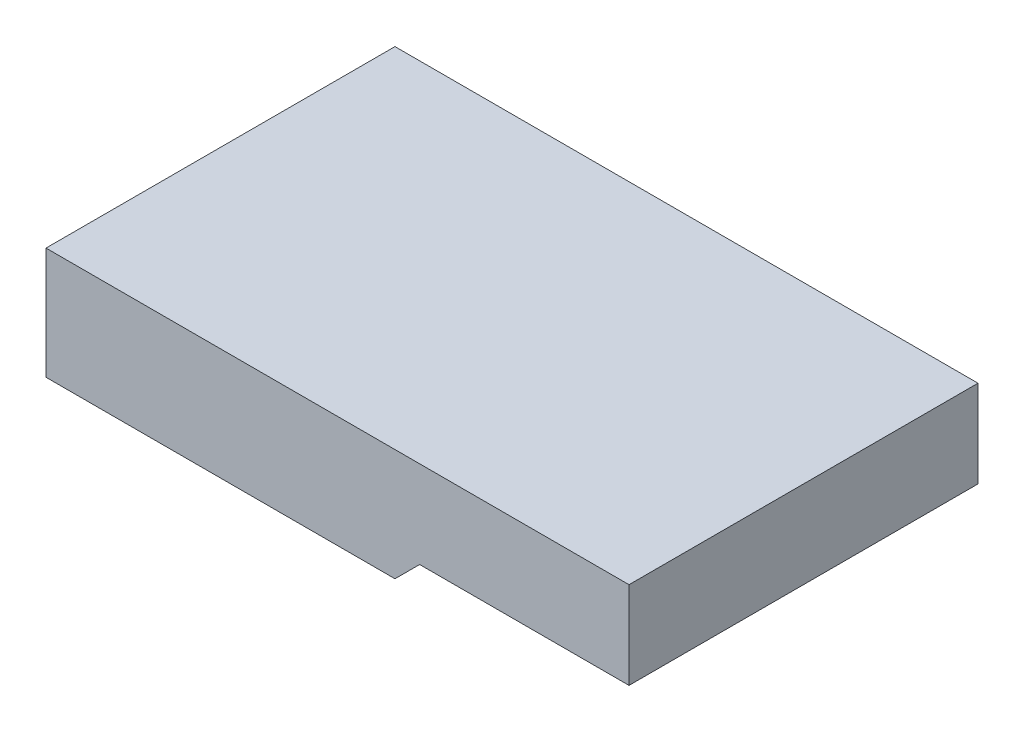
ISO-10303-21;
HEADER;
FILE_DESCRIPTION(('STEP AP214'),'2;1');
FILE_NAME('part.step','',(''),(''),'','','');
FILE_SCHEMA(('AUTOMOTIVE_DESIGN { 1 0 10303 214 1 1 1 1 }'));
ENDSEC;
DATA;
#1=APPLICATION_CONTEXT('core data for automotive mechanical design processes');
#2=APPLICATION_PROTOCOL_DEFINITION('international standard','automotive_design',2000,#1);
#3=PRODUCT_CONTEXT('',#1,'mechanical');
#4=PRODUCT('Part','Part','',(#3));
#5=PRODUCT_RELATED_PRODUCT_CATEGORY('part','',(#4));
#6=PRODUCT_DEFINITION_FORMATION('','',#4);
#7=PRODUCT_DEFINITION_CONTEXT('part definition',#1,'design');
#8=PRODUCT_DEFINITION('design','',#6,#7);
#9=PRODUCT_DEFINITION_SHAPE('','',#8);
#10=(LENGTH_UNIT() NAMED_UNIT(*) SI_UNIT(.MILLI.,.METRE.));
#11=(NAMED_UNIT(*) PLANE_ANGLE_UNIT() SI_UNIT($,.RADIAN.));
#12=(NAMED_UNIT(*) SI_UNIT($,.STERADIAN.) SOLID_ANGLE_UNIT());
#13=UNCERTAINTY_MEASURE_WITH_UNIT(LENGTH_MEASURE(1.E-05),#10,'distance_accuracy_value','');
#14=(GEOMETRIC_REPRESENTATION_CONTEXT(3) GLOBAL_UNCERTAINTY_ASSIGNED_CONTEXT((#13)) GLOBAL_UNIT_ASSIGNED_CONTEXT((#10,
#11,#12)) REPRESENTATION_CONTEXT('',''));
#15=CARTESIAN_POINT('',(0.,0.,0.));
#16=DIRECTION('',(0.,0.,1.));
#17=DIRECTION('',(1.,0.,0.));
#18=AXIS2_PLACEMENT_3D('',#15,#16,#17);
#19=CARTESIAN_POINT('',(0.,3.20710678118655,10.));
#20=DIRECTION('',(1.,0.,0.));
#21=DIRECTION('',(0.,1.,0.));
#22=AXIS2_PLACEMENT_3D('',#19,#20,#21);
#23=PLANE('',#22);
#24=DIRECTION('',(0.,-1.,0.));
#25=VECTOR('',#24,1.);
#26=CARTESIAN_POINT('',(0.,3.20710678118655,0.));
#27=LINE('',#26,#25);
#28=CARTESIAN_POINT('',(0.,3.20710678118655,0.));
#29=VERTEX_POINT('',#28);
#30=CARTESIAN_POINT('',(0.,0.,0.));
#31=VERTEX_POINT('',#30);
#32=EDGE_CURVE('E117',#29,#31,#27,.T.);
#33=ORIENTED_EDGE('',*,*,#32,.T.);
#34=DIRECTION('',(0.,0.,-1.));
#35=VECTOR('',#34,1.);
#36=CARTESIAN_POINT('',(0.,0.,10.));
#37=LINE('',#36,#35);
#38=CARTESIAN_POINT('',(0.,0.,10.));
#39=VERTEX_POINT('',#38);
#40=EDGE_CURVE('E11',#39,#31,#37,.T.);
#41=ORIENTED_EDGE('',*,*,#40,.F.);
#42=DIRECTION('',(0.,-1.,0.));
#43=VECTOR('',#42,1.);
#44=CARTESIAN_POINT('',(0.,3.20710678118655,10.));
#45=LINE('',#44,#43);
#46=CARTESIAN_POINT('',(0.,3.20710678118655,10.));
#47=VERTEX_POINT('',#46);
#48=EDGE_CURVE('E127',#47,#39,#45,.T.);
#49=ORIENTED_EDGE('',*,*,#48,.F.);
#50=DIRECTION('',(0.,0.,-1.));
#51=VECTOR('',#50,1.);
#52=CARTESIAN_POINT('',(0.,3.20710678118655,10.));
#53=LINE('',#52,#51);
#54=EDGE_CURVE('E113',#47,#29,#53,.T.);
#55=ORIENTED_EDGE('',*,*,#54,.T.);
#56=EDGE_LOOP('',(#33,#41,#49,#55));
#57=FACE_BOUND('',#56,.T.);
#58=ADVANCED_FACE('F33',(#57),#23,.F.);
#59=CARTESIAN_POINT('',(0.,0.,10.));
#60=DIRECTION('',(0.,1.,0.));
#61=DIRECTION('',(0.,0.,1.));
#62=AXIS2_PLACEMENT_3D('',#59,#60,#61);
#63=PLANE('',#62);
#64=DIRECTION('',(1.,0.,0.));
#65=VECTOR('',#64,1.);
#66=CARTESIAN_POINT('',(0.,0.,0.));
#67=LINE('',#66,#65);
#68=CARTESIAN_POINT('',(10.,0.,0.));
#69=VERTEX_POINT('',#68);
#70=EDGE_CURVE('E120',#31,#69,#67,.T.);
#71=ORIENTED_EDGE('',*,*,#70,.T.);
#72=DIRECTION('',(0.,0.,-1.));
#73=VECTOR('',#72,1.);
#74=CARTESIAN_POINT('',(10.,0.,10.));
#75=LINE('',#74,#73);
#76=CARTESIAN_POINT('',(10.,0.,10.));
#77=VERTEX_POINT('',#76);
#78=EDGE_CURVE('E41',#77,#69,#75,.T.);
#79=ORIENTED_EDGE('',*,*,#78,.F.);
#80=DIRECTION('',(1.,0.,0.));
#81=VECTOR('',#80,1.);
#82=CARTESIAN_POINT('',(0.,0.,10.));
#83=LINE('',#82,#81);
#84=EDGE_CURVE('E86',#39,#77,#83,.T.);
#85=ORIENTED_EDGE('',*,*,#84,.F.);
#86=ORIENTED_EDGE('',*,*,#40,.T.);
#87=EDGE_LOOP('',(#71,#79,#85,#86));
#88=FACE_BOUND('',#87,.T.);
#89=ADVANCED_FACE('F151',(#88),#63,.F.);
#90=CARTESIAN_POINT('',(10.,0.,10.));
#91=DIRECTION('',(-0.70710678118655,0.707106781186545,0.));
#92=DIRECTION('',(-0.707106781186545,-0.70710678118655,0.));
#93=AXIS2_PLACEMENT_3D('',#90,#91,#92);
#94=PLANE('',#93);
#95=DIRECTION('',(0.707106781186545,0.70710678118655,0.));
#96=VECTOR('',#95,1.);
#97=CARTESIAN_POINT('',(10.,0.,0.));
#98=LINE('',#97,#96);
#99=CARTESIAN_POINT('',(10.7071067811865,0.707106781186549,0.));
#100=VERTEX_POINT('',#99);
#101=EDGE_CURVE('E122',#69,#100,#98,.T.);
#102=ORIENTED_EDGE('',*,*,#101,.T.);
#103=DIRECTION('',(0.,0.,-1.));
#104=VECTOR('',#103,1.);
#105=CARTESIAN_POINT('',(10.7071067811865,0.707106781186549,10.));
#106=LINE('',#105,#104);
#107=CARTESIAN_POINT('',(10.7071067811865,0.707106781186549,10.));
#108=VERTEX_POINT('',#107);
#109=EDGE_CURVE('E108',#108,#100,#106,.T.);
#110=ORIENTED_EDGE('',*,*,#109,.F.);
#111=DIRECTION('',(0.707106781186545,0.70710678118655,0.));
#112=VECTOR('',#111,1.);
#113=CARTESIAN_POINT('',(10.,0.,10.));
#114=LINE('',#113,#112);
#115=EDGE_CURVE('E99',#77,#108,#114,.T.);
#116=ORIENTED_EDGE('',*,*,#115,.F.);
#117=ORIENTED_EDGE('',*,*,#78,.T.);
#118=EDGE_LOOP('',(#102,#110,#116,#117));
#119=FACE_BOUND('',#118,.T.);
#120=ADVANCED_FACE('F133',(#119),#94,.F.);
#121=CARTESIAN_POINT('',(10.7071067811865,0.707106781186549,10.));
#122=DIRECTION('',(0.,1.,0.));
#123=DIRECTION('',(0.,0.,1.));
#124=AXIS2_PLACEMENT_3D('',#121,#122,#123);
#125=PLANE('',#124);
#126=DIRECTION('',(1.,0.,0.));
#127=VECTOR('',#126,1.);
#128=CARTESIAN_POINT('',(10.7071067811865,0.707106781186549,0.));
#129=LINE('',#128,#127);
#130=CARTESIAN_POINT('',(16.7071067811865,0.707106781186549,0.));
#131=VERTEX_POINT('',#130);
#132=EDGE_CURVE('E107',#100,#131,#129,.T.);
#133=ORIENTED_EDGE('',*,*,#132,.T.);
#134=DIRECTION('',(0.,0.,-1.));
#135=VECTOR('',#134,1.);
#136=CARTESIAN_POINT('',(16.7071067811865,0.707106781186549,10.));
#137=LINE('',#136,#135);
#138=CARTESIAN_POINT('',(16.7071067811865,0.707106781186549,10.));
#139=VERTEX_POINT('',#138);
#140=EDGE_CURVE('E104',#139,#131,#137,.T.);
#141=ORIENTED_EDGE('',*,*,#140,.F.);
#142=DIRECTION('',(1.,0.,0.));
#143=VECTOR('',#142,1.);
#144=CARTESIAN_POINT('',(10.7071067811865,0.707106781186549,10.));
#145=LINE('',#144,#143);
#146=EDGE_CURVE('E93',#108,#139,#145,.T.);
#147=ORIENTED_EDGE('',*,*,#146,.F.);
#148=ORIENTED_EDGE('',*,*,#109,.T.);
#149=EDGE_LOOP('',(#133,#141,#147,#148));
#150=FACE_BOUND('',#149,.T.);
#151=ADVANCED_FACE('F105',(#150),#125,.F.);
#152=CARTESIAN_POINT('',(16.7071067811865,0.707106781186549,10.));
#153=DIRECTION('',(-1.,0.,0.));
#154=DIRECTION('',(0.,0.,1.));
#155=AXIS2_PLACEMENT_3D('',#152,#153,#154);
#156=PLANE('',#155);
#157=DIRECTION('',(0.,1.,0.));
#158=VECTOR('',#157,1.);
#159=CARTESIAN_POINT('',(16.7071067811865,0.707106781186549,0.));
#160=LINE('',#159,#158);
#161=CARTESIAN_POINT('',(16.7071067811865,3.20710678118655,0.));
#162=VERTEX_POINT('',#161);
#163=EDGE_CURVE('E72',#131,#162,#160,.T.);
#164=ORIENTED_EDGE('',*,*,#163,.T.);
#165=DIRECTION('',(0.,0.,-1.));
#166=VECTOR('',#165,1.);
#167=CARTESIAN_POINT('',(16.7071067811865,3.20710678118655,10.));
#168=LINE('',#167,#166);
#169=CARTESIAN_POINT('',(16.7071067811865,3.20710678118655,10.));
#170=VERTEX_POINT('',#169);
#171=EDGE_CURVE('E109',#170,#162,#168,.T.);
#172=ORIENTED_EDGE('',*,*,#171,.F.);
#173=DIRECTION('',(0.,1.,0.));
#174=VECTOR('',#173,1.);
#175=CARTESIAN_POINT('',(16.7071067811865,0.707106781186549,10.));
#176=LINE('',#175,#174);
#177=EDGE_CURVE('E97',#139,#170,#176,.T.);
#178=ORIENTED_EDGE('',*,*,#177,.F.);
#179=ORIENTED_EDGE('',*,*,#140,.T.);
#180=EDGE_LOOP('',(#164,#172,#178,#179));
#181=FACE_BOUND('',#180,.T.);
#182=ADVANCED_FACE('F111',(#181),#156,.F.);
#183=CARTESIAN_POINT('',(16.7071067811865,3.20710678118655,10.));
#184=DIRECTION('',(0.,-1.,0.));
#185=DIRECTION('',(1.,0.,0.));
#186=AXIS2_PLACEMENT_3D('',#183,#184,#185);
#187=PLANE('',#186);
#188=DIRECTION('',(-1.,0.,0.));
#189=VECTOR('',#188,1.);
#190=CARTESIAN_POINT('',(16.7071067811865,3.20710678118655,0.));
#191=LINE('',#190,#189);
#192=EDGE_CURVE('E78',#162,#29,#191,.T.);
#193=ORIENTED_EDGE('',*,*,#192,.T.);
#194=ORIENTED_EDGE('',*,*,#54,.F.);
#195=DIRECTION('',(-1.,0.,0.));
#196=VECTOR('',#195,1.);
#197=CARTESIAN_POINT('',(16.7071067811865,3.20710678118655,10.));
#198=LINE('',#197,#196);
#199=EDGE_CURVE('E49',#170,#47,#198,.T.);
#200=ORIENTED_EDGE('',*,*,#199,.F.);
#201=ORIENTED_EDGE('',*,*,#171,.T.);
#202=EDGE_LOOP('',(#193,#194,#200,#201));
#203=FACE_BOUND('',#202,.T.);
#204=ADVANCED_FACE('F140',(#203),#187,.F.);
#205=CARTESIAN_POINT('',(0.,0.,10.));
#206=DIRECTION('',(0.,0.,1.));
#207=DIRECTION('',(1.,0.,0.));
#208=AXIS2_PLACEMENT_3D('',#205,#206,#207);
#209=PLANE('',#208);
#210=ORIENTED_EDGE('',*,*,#48,.T.);
#211=ORIENTED_EDGE('',*,*,#84,.T.);
#212=ORIENTED_EDGE('',*,*,#115,.T.);
#213=ORIENTED_EDGE('',*,*,#146,.T.);
#214=ORIENTED_EDGE('',*,*,#177,.T.);
#215=ORIENTED_EDGE('',*,*,#199,.T.);
#216=EDGE_LOOP('',(#210,#211,#212,#213,#214,#215));
#217=FACE_BOUND('',#216,.T.);
#218=ADVANCED_FACE('F95',(#217),#209,.T.);
#219=CARTESIAN_POINT('',(0.,0.,0.));
#220=DIRECTION('',(0.,0.,1.));
#221=DIRECTION('',(1.,0.,0.));
#222=AXIS2_PLACEMENT_3D('',#219,#220,#221);
#223=PLANE('',#222);
#224=ORIENTED_EDGE('',*,*,#32,.F.);
#225=ORIENTED_EDGE('',*,*,#192,.F.);
#226=ORIENTED_EDGE('',*,*,#163,.F.);
#227=ORIENTED_EDGE('',*,*,#132,.F.);
#228=ORIENTED_EDGE('',*,*,#101,.F.);
#229=ORIENTED_EDGE('',*,*,#70,.F.);
#230=EDGE_LOOP('',(#224,#225,#226,#227,#228,#229));
#231=FACE_BOUND('',#230,.T.);
#232=ADVANCED_FACE('F136',(#231),#223,.F.);
#233=CLOSED_SHELL('',(#58,#89,#120,#151,#182,#204,#218,#232));
#234=MANIFOLD_SOLID_BREP('B2',#233);
#235=ADVANCED_BREP_SHAPE_REPRESENTATION('',(#18,#234),#14);
#236=SHAPE_DEFINITION_REPRESENTATION(#9,#235);
ENDSEC;
END-ISO-10303-21;
